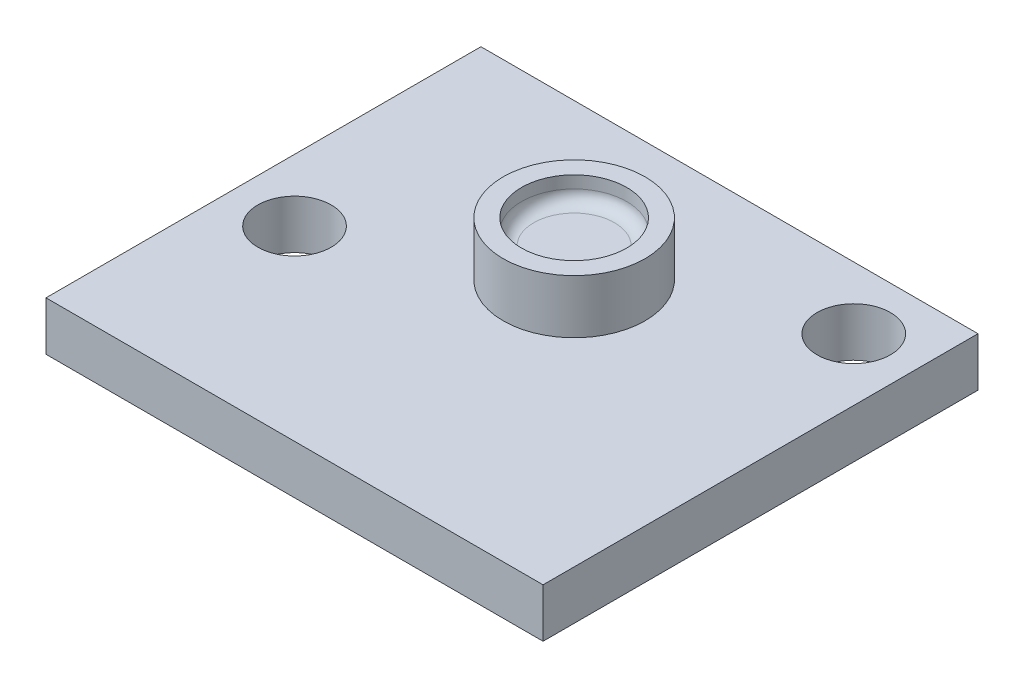
ISO-10303-21;
HEADER;
FILE_DESCRIPTION(('STEP AP214'),'2;1');
FILE_NAME('part.step','',(''),(''),'','','');
FILE_SCHEMA(('AUTOMOTIVE_DESIGN { 1 0 10303 214 1 1 1 1 }'));
ENDSEC;
DATA;
#1=APPLICATION_CONTEXT('core data for automotive mechanical design processes');
#2=APPLICATION_PROTOCOL_DEFINITION('international standard','automotive_design',2000,#1);
#3=PRODUCT_CONTEXT('',#1,'mechanical');
#4=PRODUCT('Part','Part','',(#3));
#5=PRODUCT_RELATED_PRODUCT_CATEGORY('part','',(#4));
#6=PRODUCT_DEFINITION_FORMATION('','',#4);
#7=PRODUCT_DEFINITION_CONTEXT('part definition',#1,'design');
#8=PRODUCT_DEFINITION('design','',#6,#7);
#9=PRODUCT_DEFINITION_SHAPE('','',#8);
#10=(LENGTH_UNIT() NAMED_UNIT(*) SI_UNIT(.MILLI.,.METRE.));
#11=(NAMED_UNIT(*) PLANE_ANGLE_UNIT() SI_UNIT($,.RADIAN.));
#12=(NAMED_UNIT(*) SI_UNIT($,.STERADIAN.) SOLID_ANGLE_UNIT());
#13=UNCERTAINTY_MEASURE_WITH_UNIT(LENGTH_MEASURE(1.E-05),#10,'distance_accuracy_value','');
#14=(GEOMETRIC_REPRESENTATION_CONTEXT(3) GLOBAL_UNCERTAINTY_ASSIGNED_CONTEXT((#13)) GLOBAL_UNIT_ASSIGNED_CONTEXT((#10,
#11,#12)) REPRESENTATION_CONTEXT('',''));
#15=CARTESIAN_POINT('',(0.,0.,0.));
#16=DIRECTION('',(0.,0.,1.));
#17=DIRECTION('',(1.,0.,0.));
#18=AXIS2_PLACEMENT_3D('',#15,#16,#17);
#19=CARTESIAN_POINT('',(7.62,2.,-6.35));
#20=DIRECTION('',(0.,-1.,0.));
#21=DIRECTION('',(0.,0.,-1.));
#22=AXIS2_PLACEMENT_3D('',#19,#20,#21);
#23=CYLINDRICAL_SURFACE('',#22,1.5);
#24=CARTESIAN_POINT('',(7.62,0.,-6.35));
#25=DIRECTION('',(0.,1.,0.));
#26=DIRECTION('',(0.,0.,1.));
#27=AXIS2_PLACEMENT_3D('',#24,#25,#26);
#28=CIRCLE('',#27,1.5);
#29=CARTESIAN_POINT('',(7.62,0.,-4.85));
#30=VERTEX_POINT('',#29);
#31=EDGE_CURVE('E177',#30,#30,#28,.T.);
#32=ORIENTED_EDGE('',*,*,#31,.F.);
#33=EDGE_LOOP('',(#32));
#34=FACE_BOUND('',#33,.T.);
#35=CARTESIAN_POINT('',(7.62,2.,-6.35));
#36=DIRECTION('',(0.,1.,0.));
#37=DIRECTION('',(0.,0.,1.));
#38=AXIS2_PLACEMENT_3D('',#35,#36,#37);
#39=CIRCLE('',#38,1.5);
#40=CARTESIAN_POINT('',(7.62,2.,-4.85));
#41=VERTEX_POINT('',#40);
#42=EDGE_CURVE('E220',#41,#41,#39,.T.);
#43=ORIENTED_EDGE('',*,*,#42,.T.);
#44=EDGE_LOOP('',(#43));
#45=FACE_BOUND('',#44,.T.);
#46=ADVANCED_FACE('F130',(#34,#45),#23,.F.);
#47=CARTESIAN_POINT('',(0.,0.,0.));
#48=DIRECTION('',(0.,1.,0.));
#49=DIRECTION('',(0.,0.,1.));
#50=AXIS2_PLACEMENT_3D('',#47,#48,#49);
#51=PLANE('',#50);
#52=ORIENTED_EDGE('',*,*,#31,.T.);
#53=EDGE_LOOP('',(#52));
#54=FACE_BOUND('',#53,.T.);
#55=CARTESIAN_POINT('',(-7.62,0.,1.27));
#56=DIRECTION('',(0.,1.,0.));
#57=DIRECTION('',(0.,0.,1.));
#58=AXIS2_PLACEMENT_3D('',#55,#56,#57);
#59=CIRCLE('',#58,1.5);
#60=CARTESIAN_POINT('',(-7.62,0.,2.77));
#61=VERTEX_POINT('',#60);
#62=EDGE_CURVE('E187',#61,#61,#59,.T.);
#63=ORIENTED_EDGE('',*,*,#62,.T.);
#64=EDGE_LOOP('',(#63));
#65=FACE_BOUND('',#64,.T.);
#66=DIRECTION('',(0.,0.,-1.));
#67=VECTOR('',#66,1.);
#68=CARTESIAN_POINT('',(-10.16,0.,0.));
#69=LINE('',#68,#67);
#70=CARTESIAN_POINT('',(-10.16,0.,8.89));
#71=VERTEX_POINT('',#70);
#72=CARTESIAN_POINT('',(-10.16,0.,-8.89));
#73=VERTEX_POINT('',#72);
#74=EDGE_CURVE('E171',#71,#73,#69,.T.);
#75=ORIENTED_EDGE('',*,*,#74,.T.);
#76=DIRECTION('',(1.,0.,0.));
#77=VECTOR('',#76,1.);
#78=CARTESIAN_POINT('',(-10.16,0.,-8.89));
#79=LINE('',#78,#77);
#80=CARTESIAN_POINT('',(10.16,0.,-8.89));
#81=VERTEX_POINT('',#80);
#82=EDGE_CURVE('E176',#73,#81,#79,.T.);
#83=ORIENTED_EDGE('',*,*,#82,.T.);
#84=DIRECTION('',(0.,0.,-1.));
#85=VECTOR('',#84,1.);
#86=CARTESIAN_POINT('',(10.16,0.,8.89));
#87=LINE('',#86,#85);
#88=CARTESIAN_POINT('',(10.16,0.,8.89));
#89=VERTEX_POINT('',#88);
#90=EDGE_CURVE('E194',#89,#81,#87,.T.);
#91=ORIENTED_EDGE('',*,*,#90,.F.);
#92=DIRECTION('',(1.,0.,0.));
#93=VECTOR('',#92,1.);
#94=CARTESIAN_POINT('',(0.,0.,8.89));
#95=LINE('',#94,#93);
#96=EDGE_CURVE('E166',#71,#89,#95,.T.);
#97=ORIENTED_EDGE('',*,*,#96,.F.);
#98=EDGE_LOOP('',(#75,#83,#91,#97));
#99=FACE_BOUND('',#98,.T.);
#100=ADVANCED_FACE('F173',(#54,#65,#99),#51,.F.);
#101=CARTESIAN_POINT('',(-7.62,2.,1.27));
#102=DIRECTION('',(0.,-1.,0.));
#103=DIRECTION('',(0.,0.,-1.));
#104=AXIS2_PLACEMENT_3D('',#101,#102,#103);
#105=CYLINDRICAL_SURFACE('',#104,1.5);
#106=CARTESIAN_POINT('',(-7.62,2.,1.27));
#107=DIRECTION('',(0.,1.,0.));
#108=DIRECTION('',(0.,0.,1.));
#109=AXIS2_PLACEMENT_3D('',#106,#107,#108);
#110=CIRCLE('',#109,1.5);
#111=CARTESIAN_POINT('',(-7.62,2.,2.77));
#112=VERTEX_POINT('',#111);
#113=EDGE_CURVE('E223',#112,#112,#110,.T.);
#114=ORIENTED_EDGE('',*,*,#113,.T.);
#115=EDGE_LOOP('',(#114));
#116=FACE_BOUND('',#115,.T.);
#117=ORIENTED_EDGE('',*,*,#62,.F.);
#118=EDGE_LOOP('',(#117));
#119=FACE_BOUND('',#118,.T.);
#120=ADVANCED_FACE('F237',(#116,#119),#105,.F.);
#121=CARTESIAN_POINT('',(0.,2.,8.89));
#122=DIRECTION('',(0.,0.,-1.));
#123=DIRECTION('',(-1.,0.,0.));
#124=AXIS2_PLACEMENT_3D('',#121,#122,#123);
#125=PLANE('',#124);
#126=ORIENTED_EDGE('',*,*,#96,.T.);
#127=DIRECTION('',(0.,-1.,0.));
#128=VECTOR('',#127,1.);
#129=CARTESIAN_POINT('',(10.16,2.,8.89));
#130=LINE('',#129,#128);
#131=CARTESIAN_POINT('',(10.16,2.,8.89));
#132=VERTEX_POINT('',#131);
#133=EDGE_CURVE('E188',#132,#89,#130,.T.);
#134=ORIENTED_EDGE('',*,*,#133,.F.);
#135=DIRECTION('',(1.,0.,0.));
#136=VECTOR('',#135,1.);
#137=CARTESIAN_POINT('',(0.,2.,8.89));
#138=LINE('',#137,#136);
#139=CARTESIAN_POINT('',(-10.16,2.,8.89));
#140=VERTEX_POINT('',#139);
#141=EDGE_CURVE('E210',#140,#132,#138,.T.);
#142=ORIENTED_EDGE('',*,*,#141,.F.);
#143=DIRECTION('',(0.,-1.,0.));
#144=VECTOR('',#143,1.);
#145=CARTESIAN_POINT('',(-10.16,2.,8.89));
#146=LINE('',#145,#144);
#147=EDGE_CURVE('E147',#140,#71,#146,.T.);
#148=ORIENTED_EDGE('',*,*,#147,.T.);
#149=EDGE_LOOP('',(#126,#134,#142,#148));
#150=FACE_BOUND('',#149,.T.);
#151=ADVANCED_FACE('F219',(#150),#125,.F.);
#152=CARTESIAN_POINT('',(-10.16,2.,0.));
#153=DIRECTION('',(-1.,0.,0.));
#154=DIRECTION('',(0.,0.,1.));
#155=AXIS2_PLACEMENT_3D('',#152,#153,#154);
#156=PLANE('',#155);
#157=ORIENTED_EDGE('',*,*,#74,.F.);
#158=ORIENTED_EDGE('',*,*,#147,.F.);
#159=DIRECTION('',(0.,0.,-1.));
#160=VECTOR('',#159,1.);
#161=CARTESIAN_POINT('',(-10.16,2.,0.));
#162=LINE('',#161,#160);
#163=CARTESIAN_POINT('',(-10.16,2.,-8.89));
#164=VERTEX_POINT('',#163);
#165=EDGE_CURVE('E183',#140,#164,#162,.T.);
#166=ORIENTED_EDGE('',*,*,#165,.T.);
#167=DIRECTION('',(0.,-1.,0.));
#168=VECTOR('',#167,1.);
#169=CARTESIAN_POINT('',(-10.16,2.,-8.89));
#170=LINE('',#169,#168);
#171=EDGE_CURVE('E180',#164,#73,#170,.T.);
#172=ORIENTED_EDGE('',*,*,#171,.T.);
#173=EDGE_LOOP('',(#157,#158,#166,#172));
#174=FACE_BOUND('',#173,.T.);
#175=ADVANCED_FACE('F181',(#174),#156,.T.);
#176=CARTESIAN_POINT('',(0.,2.,0.));
#177=DIRECTION('',(0.,1.,0.));
#178=DIRECTION('',(0.,0.,1.));
#179=AXIS2_PLACEMENT_3D('',#176,#177,#178);
#180=PLANE('',#179);
#181=CARTESIAN_POINT('',(0.,2.,-2.54));
#182=DIRECTION('',(0.,1.,0.));
#183=DIRECTION('',(0.,0.,1.));
#184=AXIS2_PLACEMENT_3D('',#181,#182,#183);
#185=CIRCLE('',#184,2.9);
#186=CARTESIAN_POINT('',(0.,2.,0.359999999999996));
#187=VERTEX_POINT('',#186);
#188=EDGE_CURVE('E200',#187,#187,#185,.T.);
#189=ORIENTED_EDGE('',*,*,#188,.F.);
#190=EDGE_LOOP('',(#189));
#191=FACE_BOUND('',#190,.T.);
#192=ORIENTED_EDGE('',*,*,#42,.F.);
#193=EDGE_LOOP('',(#192));
#194=FACE_BOUND('',#193,.T.);
#195=ORIENTED_EDGE('',*,*,#113,.F.);
#196=EDGE_LOOP('',(#195));
#197=FACE_BOUND('',#196,.T.);
#198=DIRECTION('',(1.,0.,0.));
#199=VECTOR('',#198,1.);
#200=CARTESIAN_POINT('',(-10.16,2.,-8.89));
#201=LINE('',#200,#199);
#202=CARTESIAN_POINT('',(10.16,2.,-8.89));
#203=VERTEX_POINT('',#202);
#204=EDGE_CURVE('E197',#164,#203,#201,.T.);
#205=ORIENTED_EDGE('',*,*,#204,.F.);
#206=ORIENTED_EDGE('',*,*,#165,.F.);
#207=ORIENTED_EDGE('',*,*,#141,.T.);
#208=DIRECTION('',(0.,0.,-1.));
#209=VECTOR('',#208,1.);
#210=CARTESIAN_POINT('',(10.16,2.,8.89));
#211=LINE('',#210,#209);
#212=EDGE_CURVE('E203',#132,#203,#211,.T.);
#213=ORIENTED_EDGE('',*,*,#212,.T.);
#214=EDGE_LOOP('',(#205,#206,#207,#213));
#215=FACE_BOUND('',#214,.T.);
#216=ADVANCED_FACE('F216',(#191,#194,#197,#215),#180,.T.);
#217=CARTESIAN_POINT('',(-10.16,2.,-8.89));
#218=DIRECTION('',(0.,0.,-1.));
#219=DIRECTION('',(-1.,0.,0.));
#220=AXIS2_PLACEMENT_3D('',#217,#218,#219);
#221=PLANE('',#220);
#222=ORIENTED_EDGE('',*,*,#82,.F.);
#223=ORIENTED_EDGE('',*,*,#171,.F.);
#224=ORIENTED_EDGE('',*,*,#204,.T.);
#225=DIRECTION('',(0.,-1.,0.));
#226=VECTOR('',#225,1.);
#227=CARTESIAN_POINT('',(10.16,2.,-8.89));
#228=LINE('',#227,#226);
#229=EDGE_CURVE('E192',#203,#81,#228,.T.);
#230=ORIENTED_EDGE('',*,*,#229,.T.);
#231=EDGE_LOOP('',(#222,#223,#224,#230));
#232=FACE_BOUND('',#231,.T.);
#233=ADVANCED_FACE('F190',(#232),#221,.T.);
#234=CARTESIAN_POINT('',(10.16,2.,8.89));
#235=DIRECTION('',(-1.,0.,0.));
#236=DIRECTION('',(0.,0.,1.));
#237=AXIS2_PLACEMENT_3D('',#234,#235,#236);
#238=PLANE('',#237);
#239=ORIENTED_EDGE('',*,*,#90,.T.);
#240=ORIENTED_EDGE('',*,*,#229,.F.);
#241=ORIENTED_EDGE('',*,*,#212,.F.);
#242=ORIENTED_EDGE('',*,*,#133,.T.);
#243=EDGE_LOOP('',(#239,#240,#241,#242));
#244=FACE_BOUND('',#243,.T.);
#245=ADVANCED_FACE('F218',(#244),#238,.F.);
#246=CARTESIAN_POINT('',(0.,4.2,-2.54));
#247=DIRECTION('',(0.,-1.,0.));
#248=DIRECTION('',(0.,0.,-1.));
#249=AXIS2_PLACEMENT_3D('',#246,#247,#248);
#250=CYLINDRICAL_SURFACE('',#249,2.9);
#251=CARTESIAN_POINT('',(0.,4.2,-2.54));
#252=DIRECTION('',(0.,1.,0.));
#253=DIRECTION('',(0.,0.,1.));
#254=AXIS2_PLACEMENT_3D('',#251,#252,#253);
#255=CIRCLE('',#254,2.9);
#256=CARTESIAN_POINT('',(0.,4.2,0.359999999999996));
#257=VERTEX_POINT('',#256);
#258=EDGE_CURVE('E195',#257,#257,#255,.T.);
#259=ORIENTED_EDGE('',*,*,#258,.F.);
#260=EDGE_LOOP('',(#259));
#261=FACE_BOUND('',#260,.T.);
#262=ORIENTED_EDGE('',*,*,#188,.T.);
#263=EDGE_LOOP('',(#262));
#264=FACE_BOUND('',#263,.T.);
#265=ADVANCED_FACE('F259',(#261,#264),#250,.T.);
#266=CARTESIAN_POINT('',(0.,4.2,-2.54));
#267=DIRECTION('',(0.,1.,0.));
#268=DIRECTION('',(0.,0.,1.));
#269=AXIS2_PLACEMENT_3D('',#266,#267,#268);
#270=PLANE('',#269);
#271=CARTESIAN_POINT('',(0.,4.2,-2.54));
#272=DIRECTION('',(0.,1.,0.));
#273=DIRECTION('',(0.,0.,1.));
#274=AXIS2_PLACEMENT_3D('',#271,#272,#273);
#275=CIRCLE('',#274,2.15);
#276=CARTESIAN_POINT('',(0.,4.2,-0.390000000000004));
#277=VERTEX_POINT('',#276);
#278=EDGE_CURVE('E249',#277,#277,#275,.T.);
#279=ORIENTED_EDGE('',*,*,#278,.F.);
#280=EDGE_LOOP('',(#279));
#281=FACE_BOUND('',#280,.T.);
#282=ORIENTED_EDGE('',*,*,#258,.T.);
#283=EDGE_LOOP('',(#282));
#284=FACE_BOUND('',#283,.T.);
#285=ADVANCED_FACE('F256',(#281,#284),#270,.T.);
#286=CARTESIAN_POINT('',(0.,3.2,-2.54));
#287=DIRECTION('',(0.,1.,0.));
#288=DIRECTION('',(0.,0.,1.));
#289=AXIS2_PLACEMENT_3D('',#286,#287,#288);
#290=CYLINDRICAL_SURFACE('',#289,2.15);
#291=CARTESIAN_POINT('',(0.,3.7,-2.54));
#292=DIRECTION('',(0.,1.,0.));
#293=DIRECTION('',(0.,0.,1.));
#294=AXIS2_PLACEMENT_3D('',#291,#292,#293);
#295=CIRCLE('',#294,2.15);
#296=CARTESIAN_POINT('',(0.,3.7,-0.390000000000004));
#297=VERTEX_POINT('',#296);
#298=EDGE_CURVE('E12',#297,#297,#295,.F.);
#299=ORIENTED_EDGE('',*,*,#298,.T.);
#300=EDGE_LOOP('',(#299));
#301=FACE_BOUND('',#300,.T.);
#302=ORIENTED_EDGE('',*,*,#278,.T.);
#303=EDGE_LOOP('',(#302));
#304=FACE_BOUND('',#303,.T.);
#305=ADVANCED_FACE('F254',(#301,#304),#290,.F.);
#306=CARTESIAN_POINT('',(0.,3.2,-2.54));
#307=DIRECTION('',(0.,1.,0.));
#308=DIRECTION('',(0.,0.,1.));
#309=AXIS2_PLACEMENT_3D('',#306,#307,#308);
#310=PLANE('',#309);
#311=CARTESIAN_POINT('',(0.,3.2,-2.54));
#312=DIRECTION('',(0.,1.,0.));
#313=DIRECTION('',(0.,0.,1.));
#314=AXIS2_PLACEMENT_3D('',#311,#312,#313);
#315=CIRCLE('',#314,1.65);
#316=CARTESIAN_POINT('',(0.,3.2,-0.890000000000004));
#317=VERTEX_POINT('',#316);
#318=EDGE_CURVE('E139',#317,#317,#315,.T.);
#319=ORIENTED_EDGE('',*,*,#318,.T.);
#320=EDGE_LOOP('',(#319));
#321=FACE_BOUND('',#320,.T.);
#322=ADVANCED_FACE('F312',(#321),#310,.T.);
#323=CARTESIAN_POINT('',(0.,3.7,-2.54));
#324=DIRECTION('',(0.,1.,0.));
#325=DIRECTION('',(0.,0.,1.));
#326=AXIS2_PLACEMENT_3D('',#323,#324,#325);
#327=TOROIDAL_SURFACE('',#326,1.65,0.5);
#328=ORIENTED_EDGE('',*,*,#298,.F.);
#329=EDGE_LOOP('',(#328));
#330=FACE_BOUND('',#329,.T.);
#331=ORIENTED_EDGE('',*,*,#318,.F.);
#332=EDGE_LOOP('',(#331));
#333=FACE_BOUND('',#332,.T.);
#334=ADVANCED_FACE('F132',(#330,#333),#327,.F.);
#335=CLOSED_SHELL('',(#46,#100,#120,#151,#175,#216,#233,#245,#265,#285,#305,#322,#334));
#336=MANIFOLD_SOLID_BREP('B2',#335);
#337=ADVANCED_BREP_SHAPE_REPRESENTATION('',(#18,#336),#14);
#338=SHAPE_DEFINITION_REPRESENTATION(#9,#337);
ENDSEC;
END-ISO-10303-21;
